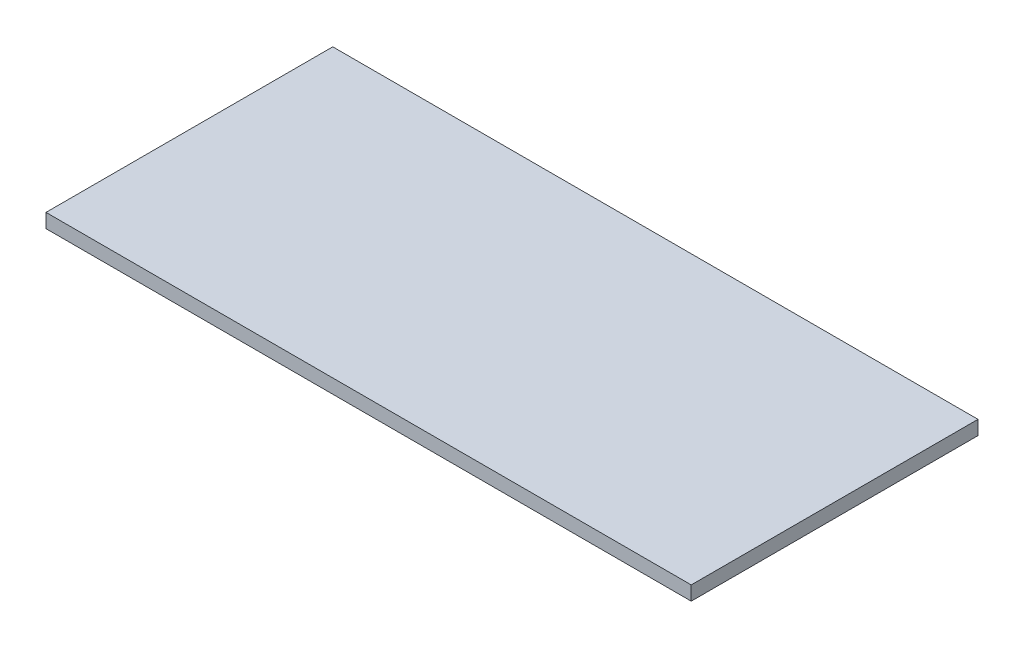
ISO-10303-21;
HEADER;
FILE_DESCRIPTION(('STEP AP214'),'2;1');
FILE_NAME('part.step','',(''),(''),'','','');
FILE_SCHEMA(('AUTOMOTIVE_DESIGN { 1 0 10303 214 1 1 1 1 }'));
ENDSEC;
DATA;
#1=APPLICATION_CONTEXT('core data for automotive mechanical design processes');
#2=APPLICATION_PROTOCOL_DEFINITION('international standard','automotive_design',2000,#1);
#3=PRODUCT_CONTEXT('',#1,'mechanical');
#4=PRODUCT('Part','Part','',(#3));
#5=PRODUCT_RELATED_PRODUCT_CATEGORY('part','',(#4));
#6=PRODUCT_DEFINITION_FORMATION('','',#4);
#7=PRODUCT_DEFINITION_CONTEXT('part definition',#1,'design');
#8=PRODUCT_DEFINITION('design','',#6,#7);
#9=PRODUCT_DEFINITION_SHAPE('','',#8);
#10=(LENGTH_UNIT() NAMED_UNIT(*) SI_UNIT(.MILLI.,.METRE.));
#11=(NAMED_UNIT(*) PLANE_ANGLE_UNIT() SI_UNIT($,.RADIAN.));
#12=(NAMED_UNIT(*) SI_UNIT($,.STERADIAN.) SOLID_ANGLE_UNIT());
#13=UNCERTAINTY_MEASURE_WITH_UNIT(LENGTH_MEASURE(1.E-05),#10,'distance_accuracy_value','');
#14=(GEOMETRIC_REPRESENTATION_CONTEXT(3) GLOBAL_UNCERTAINTY_ASSIGNED_CONTEXT((#13)) GLOBAL_UNIT_ASSIGNED_CONTEXT((#10,
#11,#12)) REPRESENTATION_CONTEXT('',''));
#15=CARTESIAN_POINT('',(0.,0.,0.));
#16=DIRECTION('',(0.,0.,1.));
#17=DIRECTION('',(1.,0.,0.));
#18=AXIS2_PLACEMENT_3D('',#15,#16,#17);
#19=CARTESIAN_POINT('',(114.3,5.,50.8));
#20=DIRECTION('',(-1.,0.,0.));
#21=DIRECTION('',(0.,0.,1.));
#22=AXIS2_PLACEMENT_3D('',#19,#20,#21);
#23=PLANE('',#22);
#24=DIRECTION('',(0.,0.,-1.));
#25=VECTOR('',#24,1.);
#26=CARTESIAN_POINT('',(114.3,0.,50.8));
#27=LINE('',#26,#25);
#28=CARTESIAN_POINT('',(114.3,0.,50.8));
#29=VERTEX_POINT('',#28);
#30=CARTESIAN_POINT('',(114.3,0.,-50.8));
#31=VERTEX_POINT('',#30);
#32=EDGE_CURVE('E98',#29,#31,#27,.T.);
#33=ORIENTED_EDGE('',*,*,#32,.T.);
#34=DIRECTION('',(0.,-1.,0.));
#35=VECTOR('',#34,1.);
#36=CARTESIAN_POINT('',(114.3,5.,-50.8));
#37=LINE('',#36,#35);
#38=CARTESIAN_POINT('',(114.3,5.,-50.8));
#39=VERTEX_POINT('',#38);
#40=EDGE_CURVE('E11',#39,#31,#37,.T.);
#41=ORIENTED_EDGE('',*,*,#40,.F.);
#42=DIRECTION('',(0.,0.,-1.));
#43=VECTOR('',#42,1.);
#44=CARTESIAN_POINT('',(114.3,5.,50.8));
#45=LINE('',#44,#43);
#46=CARTESIAN_POINT('',(114.3,5.,50.8));
#47=VERTEX_POINT('',#46);
#48=EDGE_CURVE('E86',#47,#39,#45,.T.);
#49=ORIENTED_EDGE('',*,*,#48,.F.);
#50=DIRECTION('',(0.,-1.,0.));
#51=VECTOR('',#50,1.);
#52=CARTESIAN_POINT('',(114.3,5.,50.8));
#53=LINE('',#52,#51);
#54=EDGE_CURVE('E94',#47,#29,#53,.T.);
#55=ORIENTED_EDGE('',*,*,#54,.T.);
#56=EDGE_LOOP('',(#33,#41,#49,#55));
#57=FACE_BOUND('',#56,.T.);
#58=ADVANCED_FACE('F35',(#57),#23,.F.);
#59=CARTESIAN_POINT('',(-114.3,5.,-50.8));
#60=DIRECTION('',(0.,0.,1.));
#61=DIRECTION('',(1.,0.,0.));
#62=AXIS2_PLACEMENT_3D('',#59,#60,#61);
#63=PLANE('',#62);
#64=DIRECTION('',(-1.,0.,0.));
#65=VECTOR('',#64,1.);
#66=CARTESIAN_POINT('',(-114.3,0.,-50.8));
#67=LINE('',#66,#65);
#68=CARTESIAN_POINT('',(-114.3,0.,-50.8));
#69=VERTEX_POINT('',#68);
#70=EDGE_CURVE('E90',#31,#69,#67,.T.);
#71=ORIENTED_EDGE('',*,*,#70,.T.);
#72=DIRECTION('',(0.,-1.,0.));
#73=VECTOR('',#72,1.);
#74=CARTESIAN_POINT('',(-114.3,5.,-50.8));
#75=LINE('',#74,#73);
#76=CARTESIAN_POINT('',(-114.3,5.,-50.8));
#77=VERTEX_POINT('',#76);
#78=EDGE_CURVE('E43',#77,#69,#75,.T.);
#79=ORIENTED_EDGE('',*,*,#78,.F.);
#80=DIRECTION('',(-1.,0.,0.));
#81=VECTOR('',#80,1.);
#82=CARTESIAN_POINT('',(-114.3,5.,-50.8));
#83=LINE('',#82,#81);
#84=EDGE_CURVE('E81',#39,#77,#83,.T.);
#85=ORIENTED_EDGE('',*,*,#84,.F.);
#86=ORIENTED_EDGE('',*,*,#40,.T.);
#87=EDGE_LOOP('',(#71,#79,#85,#86));
#88=FACE_BOUND('',#87,.T.);
#89=ADVANCED_FACE('F89',(#88),#63,.F.);
#90=CARTESIAN_POINT('',(-114.3,5.,50.8));
#91=DIRECTION('',(1.,0.,0.));
#92=DIRECTION('',(0.,0.,-1.));
#93=AXIS2_PLACEMENT_3D('',#90,#91,#92);
#94=PLANE('',#93);
#95=DIRECTION('',(0.,0.,1.));
#96=VECTOR('',#95,1.);
#97=CARTESIAN_POINT('',(-114.3,0.,50.8));
#98=LINE('',#97,#96);
#99=CARTESIAN_POINT('',(-114.3,0.,50.8));
#100=VERTEX_POINT('',#99);
#101=EDGE_CURVE('E68',#69,#100,#98,.T.);
#102=ORIENTED_EDGE('',*,*,#101,.T.);
#103=DIRECTION('',(0.,-1.,0.));
#104=VECTOR('',#103,1.);
#105=CARTESIAN_POINT('',(-114.3,5.,50.8));
#106=LINE('',#105,#104);
#107=CARTESIAN_POINT('',(-114.3,5.,50.8));
#108=VERTEX_POINT('',#107);
#109=EDGE_CURVE('E91',#108,#100,#106,.T.);
#110=ORIENTED_EDGE('',*,*,#109,.F.);
#111=DIRECTION('',(0.,0.,1.));
#112=VECTOR('',#111,1.);
#113=CARTESIAN_POINT('',(-114.3,5.,50.8));
#114=LINE('',#113,#112);
#115=EDGE_CURVE('E84',#77,#108,#114,.T.);
#116=ORIENTED_EDGE('',*,*,#115,.F.);
#117=ORIENTED_EDGE('',*,*,#78,.T.);
#118=EDGE_LOOP('',(#102,#110,#116,#117));
#119=FACE_BOUND('',#118,.T.);
#120=ADVANCED_FACE('F92',(#119),#94,.F.);
#121=CARTESIAN_POINT('',(-114.3,5.,50.8));
#122=DIRECTION('',(0.,0.,-1.));
#123=DIRECTION('',(-1.,0.,0.));
#124=AXIS2_PLACEMENT_3D('',#121,#122,#123);
#125=PLANE('',#124);
#126=DIRECTION('',(1.,0.,0.));
#127=VECTOR('',#126,1.);
#128=CARTESIAN_POINT('',(-114.3,0.,50.8));
#129=LINE('',#128,#127);
#130=EDGE_CURVE('E74',#100,#29,#129,.T.);
#131=ORIENTED_EDGE('',*,*,#130,.T.);
#132=ORIENTED_EDGE('',*,*,#54,.F.);
#133=DIRECTION('',(1.,0.,0.));
#134=VECTOR('',#133,1.);
#135=CARTESIAN_POINT('',(-114.3,5.,50.8));
#136=LINE('',#135,#134);
#137=EDGE_CURVE('E51',#108,#47,#136,.T.);
#138=ORIENTED_EDGE('',*,*,#137,.F.);
#139=ORIENTED_EDGE('',*,*,#109,.T.);
#140=EDGE_LOOP('',(#131,#132,#138,#139));
#141=FACE_BOUND('',#140,.T.);
#142=ADVANCED_FACE('F105',(#141),#125,.F.);
#143=CARTESIAN_POINT('',(0.,5.,0.));
#144=DIRECTION('',(0.,-1.,0.));
#145=DIRECTION('',(0.,0.,-1.));
#146=AXIS2_PLACEMENT_3D('',#143,#144,#145);
#147=PLANE('',#146);
#148=ORIENTED_EDGE('',*,*,#48,.T.);
#149=ORIENTED_EDGE('',*,*,#84,.T.);
#150=ORIENTED_EDGE('',*,*,#115,.T.);
#151=ORIENTED_EDGE('',*,*,#137,.T.);
#152=EDGE_LOOP('',(#148,#149,#150,#151));
#153=FACE_BOUND('',#152,.T.);
#154=ADVANCED_FACE('F82',(#153),#147,.F.);
#155=CARTESIAN_POINT('',(0.,0.,0.));
#156=DIRECTION('',(0.,-1.,0.));
#157=DIRECTION('',(0.,0.,-1.));
#158=AXIS2_PLACEMENT_3D('',#155,#156,#157);
#159=PLANE('',#158);
#160=ORIENTED_EDGE('',*,*,#32,.F.);
#161=ORIENTED_EDGE('',*,*,#130,.F.);
#162=ORIENTED_EDGE('',*,*,#101,.F.);
#163=ORIENTED_EDGE('',*,*,#70,.F.);
#164=EDGE_LOOP('',(#160,#161,#162,#163));
#165=FACE_BOUND('',#164,.T.);
#166=ADVANCED_FACE('F108',(#165),#159,.T.);
#167=CLOSED_SHELL('',(#58,#89,#120,#142,#154,#166));
#168=MANIFOLD_SOLID_BREP('B2',#167);
#169=ADVANCED_BREP_SHAPE_REPRESENTATION('',(#18,#168),#14);
#170=SHAPE_DEFINITION_REPRESENTATION(#9,#169);
ENDSEC;
END-ISO-10303-21;
